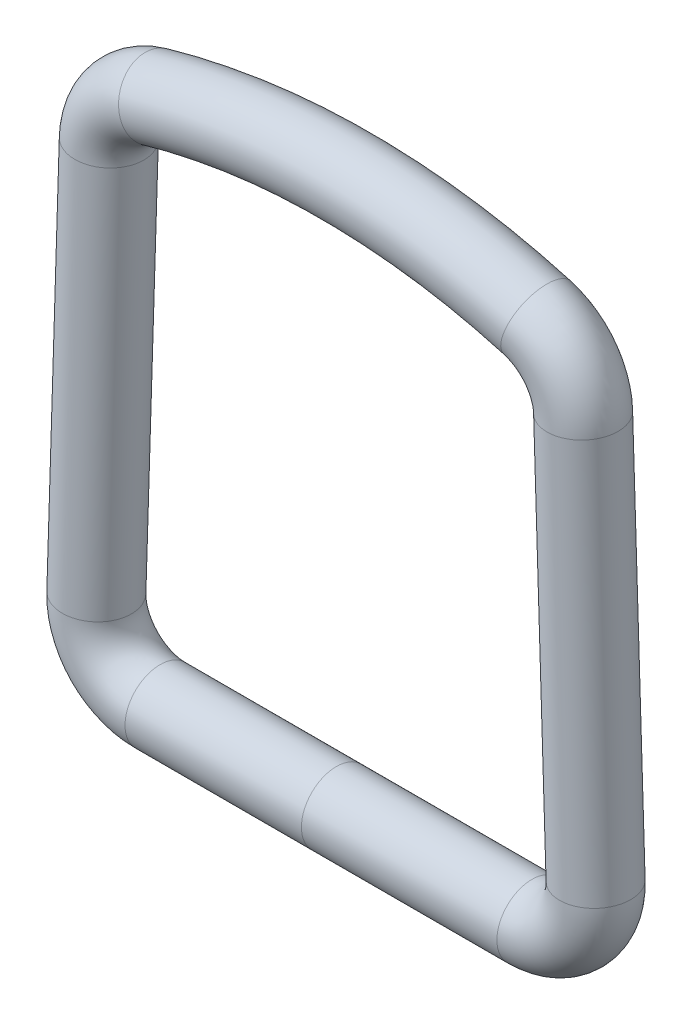
ISO-10303-21;
HEADER;
FILE_DESCRIPTION(('STEP AP214'),'2;1');
FILE_NAME('part.step','',(''),(''),'','','');
FILE_SCHEMA(('AUTOMOTIVE_DESIGN { 1 0 10303 214 1 1 1 1 }'));
ENDSEC;
DATA;
#1=APPLICATION_CONTEXT('core data for automotive mechanical design processes');
#2=APPLICATION_PROTOCOL_DEFINITION('international standard','automotive_design',2000,#1);
#3=PRODUCT_CONTEXT('',#1,'mechanical');
#4=PRODUCT('Part','Part','',(#3));
#5=PRODUCT_RELATED_PRODUCT_CATEGORY('part','',(#4));
#6=PRODUCT_DEFINITION_FORMATION('','',#4);
#7=PRODUCT_DEFINITION_CONTEXT('part definition',#1,'design');
#8=PRODUCT_DEFINITION('design','',#6,#7);
#9=PRODUCT_DEFINITION_SHAPE('','',#8);
#10=(LENGTH_UNIT() NAMED_UNIT(*) SI_UNIT(.MILLI.,.METRE.));
#11=(NAMED_UNIT(*) PLANE_ANGLE_UNIT() SI_UNIT($,.RADIAN.));
#12=(NAMED_UNIT(*) SI_UNIT($,.STERADIAN.) SOLID_ANGLE_UNIT());
#13=UNCERTAINTY_MEASURE_WITH_UNIT(LENGTH_MEASURE(1.E-05),#10,'distance_accuracy_value','');
#14=(GEOMETRIC_REPRESENTATION_CONTEXT(3) GLOBAL_UNCERTAINTY_ASSIGNED_CONTEXT((#13)) GLOBAL_UNIT_ASSIGNED_CONTEXT((#10,
#11,#12)) REPRESENTATION_CONTEXT('',''));
#15=CARTESIAN_POINT('',(0.,0.,0.));
#16=DIRECTION('',(0.,0.,1.));
#17=DIRECTION('',(1.,0.,0.));
#18=AXIS2_PLACEMENT_3D('',#15,#16,#17);
#19=CARTESIAN_POINT('',(2.06347632419776,0.,0.));
#20=DIRECTION('',(1.,0.,0.));
#21=DIRECTION('',(0.,1.,0.));
#22=AXIS2_PLACEMENT_3D('',#19,#20,#21);
#23=CYLINDRICAL_SURFACE('',#22,1.1);
#24=CARTESIAN_POINT('',(7.6,0.,0.));
#25=DIRECTION('',(1.,0.,0.));
#26=DIRECTION('',(0.,0.,-1.));
#27=AXIS2_PLACEMENT_3D('',#24,#25,#26);
#28=CIRCLE('',#27,1.1);
#29=CARTESIAN_POINT('',(7.6,0.,-1.1));
#30=VERTEX_POINT('',#29);
#31=EDGE_CURVE('E63',#30,#30,#28,.T.);
#32=ORIENTED_EDGE('',*,*,#31,.F.);
#33=EDGE_LOOP('',(#32));
#34=FACE_BOUND('',#33,.T.);
#35=CARTESIAN_POINT('',(2.06347632419776,0.,0.));
#36=DIRECTION('',(1.,0.,0.));
#37=DIRECTION('',(0.,0.,-1.));
#38=AXIS2_PLACEMENT_3D('',#35,#36,#37);
#39=CIRCLE('',#38,1.1);
#40=CARTESIAN_POINT('',(2.06347632419776,-1.1,0.));
#41=VERTEX_POINT('',#40);
#42=EDGE_CURVE('E10',#41,#41,#39,.T.);
#43=ORIENTED_EDGE('',*,*,#42,.T.);
#44=EDGE_LOOP('',(#43));
#45=FACE_BOUND('',#44,.T.);
#46=ADVANCED_FACE('F32',(#34,#45),#23,.T.);
#47=CARTESIAN_POINT('',(2.06347632419777,2.,0.));
#48=DIRECTION('',(0.,0.,1.));
#49=DIRECTION('',(1.,0.,0.));
#50=AXIS2_PLACEMENT_3D('',#47,#48,#49);
#51=TOROIDAL_SURFACE('',#50,2.,1.1);
#52=CARTESIAN_POINT('',(0.064452172023606,2.06246950475544,0.));
#53=DIRECTION('',(-0.0312347523777213,-0.999512076087079,0.));
#54=DIRECTION('',(0.,0.,-1.));
#55=AXIS2_PLACEMENT_3D('',#52,#53,#54);
#56=CIRCLE('',#55,1.1);
#57=CARTESIAN_POINT('',(-1.03501111167218,2.09682773237093,0.));
#58=VERTEX_POINT('',#57);
#59=EDGE_CURVE('E38',#58,#58,#56,.T.);
#60=CARTESIAN_POINT('',(2.06347632419777,2.,0.));
#61=DIRECTION('',(0.,0.,1.));
#62=DIRECTION('',(1.,0.,0.));
#63=AXIS2_PLACEMENT_3D('',#60,#61,#62);
#64=CIRCLE('',#63,3.1);
#65=EDGE_CURVE('',#58,#41,#64,.T.);
#66=ORIENTED_EDGE('',*,*,#59,.T.);
#67=ORIENTED_EDGE('',*,*,#42,.F.);
#68=ORIENTED_EDGE('',*,*,#65,.T.);
#69=ORIENTED_EDGE('',*,*,#65,.F.);
#70=EDGE_LOOP('',(#66,#68,#67,#69));
#71=FACE_BOUND('',#70,.T.);
#72=ADVANCED_FACE('F70',(#71),#51,.T.);
#73=CARTESIAN_POINT('',(0.456110610602567,14.5955395392822,0.));
#74=DIRECTION('',(-0.0312347523777212,-0.999512076087079,0.));
#75=DIRECTION('',(0.999512076087079,-0.0312347523777212,0.));
#76=AXIS2_PLACEMENT_3D('',#73,#74,#75);
#77=CYLINDRICAL_SURFACE('',#76,1.1);
#78=ORIENTED_EDGE('',*,*,#59,.F.);
#79=EDGE_LOOP('',(#78));
#80=FACE_BOUND('',#79,.T.);
#81=CARTESIAN_POINT('',(0.45611061060257,14.5955395392822,0.));
#82=DIRECTION('',(-0.0312347523777208,-0.999512076087079,0.));
#83=DIRECTION('',(0.,0.,-1.));
#84=AXIS2_PLACEMENT_3D('',#81,#82,#83);
#85=CIRCLE('',#84,1.1);
#86=CARTESIAN_POINT('',(-0.643352673093218,14.6298977668977,0.));
#87=VERTEX_POINT('',#86);
#88=EDGE_CURVE('E42',#87,#87,#85,.T.);
#89=ORIENTED_EDGE('',*,*,#88,.T.);
#90=EDGE_LOOP('',(#89));
#91=FACE_BOUND('',#90,.T.);
#92=ADVANCED_FACE('F74',(#80,#91),#77,.T.);
#93=CARTESIAN_POINT('',(2.45513476277672,14.5330700345268,0.));
#94=DIRECTION('',(0.,0.,1.));
#95=DIRECTION('',(1.,0.,0.));
#96=AXIS2_PLACEMENT_3D('',#93,#94,#95);
#97=TOROIDAL_SURFACE('',#96,2.,1.1);
#98=CARTESIAN_POINT('',(1.90268014358529,16.4552547014446,0.));
#99=DIRECTION('',(-0.96109233345892,-0.276227309595717,0.));
#100=DIRECTION('',(0.,0.,-1.));
#101=AXIS2_PLACEMENT_3D('',#98,#99,#100);
#102=CIRCLE('',#101,1.1);
#103=CARTESIAN_POINT('',(1.59883010303,17.5124562682494,0.));
#104=VERTEX_POINT('',#103);
#105=EDGE_CURVE('E46',#104,#104,#102,.T.);
#106=CARTESIAN_POINT('',(2.45513476277672,14.5330700345268,0.));
#107=DIRECTION('',(0.,0.,1.));
#108=DIRECTION('',(1.,0.,0.));
#109=AXIS2_PLACEMENT_3D('',#106,#107,#108);
#110=CIRCLE('',#109,3.1);
#111=EDGE_CURVE('',#104,#87,#110,.T.);
#112=ORIENTED_EDGE('',*,*,#105,.T.);
#113=ORIENTED_EDGE('',*,*,#88,.F.);
#114=ORIENTED_EDGE('',*,*,#111,.T.);
#115=ORIENTED_EDGE('',*,*,#111,.F.);
#116=EDGE_LOOP('',(#112,#114,#113,#115));
#117=FACE_BOUND('',#116,.T.);
#118=ADVANCED_FACE('F79',(#117),#97,.T.);
#119=CARTESIAN_POINT('',(7.9,-4.41153846153848,0.));
#120=DIRECTION('',(0.,0.,1.));
#121=DIRECTION('',(1.,0.,0.));
#122=AXIS2_PLACEMENT_3D('',#119,#120,#121);
#123=TOROIDAL_SURFACE('',#122,21.7115384615385,1.1);
#124=CARTESIAN_POINT('',(13.8973198564147,16.4552547014446,0.));
#125=DIRECTION('',(-0.96109233345892,0.276227309595717,0.));
#126=DIRECTION('',(0.,0.,-1.));
#127=AXIS2_PLACEMENT_3D('',#124,#125,#126);
#128=CIRCLE('',#127,1.1);
#129=CARTESIAN_POINT('',(14.20116989697,17.5124562682494,0.));
#130=VERTEX_POINT('',#129);
#131=EDGE_CURVE('E51',#130,#130,#128,.T.);
#132=CARTESIAN_POINT('',(7.9,-4.41153846153848,0.));
#133=DIRECTION('',(0.,0.,1.));
#134=DIRECTION('',(1.,0.,0.));
#135=AXIS2_PLACEMENT_3D('',#132,#133,#134);
#136=CIRCLE('',#135,22.8115384615385);
#137=EDGE_CURVE('',#130,#104,#136,.T.);
#138=ORIENTED_EDGE('',*,*,#131,.T.);
#139=ORIENTED_EDGE('',*,*,#105,.F.);
#140=ORIENTED_EDGE('',*,*,#137,.T.);
#141=ORIENTED_EDGE('',*,*,#137,.F.);
#142=EDGE_LOOP('',(#138,#140,#139,#141));
#143=FACE_BOUND('',#142,.T.);
#144=ADVANCED_FACE('F85',(#143),#123,.T.);
#145=CARTESIAN_POINT('',(13.3448652372233,14.5330700345268,0.));
#146=DIRECTION('',(0.,0.,1.));
#147=DIRECTION('',(1.,0.,0.));
#148=AXIS2_PLACEMENT_3D('',#145,#146,#147);
#149=TOROIDAL_SURFACE('',#148,2.,1.1);
#150=CARTESIAN_POINT('',(15.3438893893974,14.5955395392822,0.));
#151=DIRECTION('',(-0.0312347523777213,0.999512076087079,0.));
#152=DIRECTION('',(0.,0.,-1.));
#153=AXIS2_PLACEMENT_3D('',#150,#151,#152);
#154=CIRCLE('',#153,1.1);
#155=CARTESIAN_POINT('',(16.4433526730932,14.6298977668977,0.));
#156=VERTEX_POINT('',#155);
#157=EDGE_CURVE('E54',#156,#156,#154,.T.);
#158=CARTESIAN_POINT('',(13.3448652372233,14.5330700345268,0.));
#159=DIRECTION('',(0.,0.,1.));
#160=DIRECTION('',(1.,0.,0.));
#161=AXIS2_PLACEMENT_3D('',#158,#159,#160);
#162=CIRCLE('',#161,3.1);
#163=EDGE_CURVE('',#156,#130,#162,.T.);
#164=ORIENTED_EDGE('',*,*,#157,.T.);
#165=ORIENTED_EDGE('',*,*,#131,.F.);
#166=ORIENTED_EDGE('',*,*,#163,.T.);
#167=ORIENTED_EDGE('',*,*,#163,.F.);
#168=EDGE_LOOP('',(#164,#166,#165,#167));
#169=FACE_BOUND('',#168,.T.);
#170=ADVANCED_FACE('F89',(#169),#149,.T.);
#171=CARTESIAN_POINT('',(15.7355478279764,2.06246950475544,0.));
#172=DIRECTION('',(-0.0312347523777214,0.999512076087079,0.));
#173=DIRECTION('',(-0.999512076087079,-0.0312347523777214,0.));
#174=AXIS2_PLACEMENT_3D('',#171,#172,#173);
#175=CYLINDRICAL_SURFACE('',#174,1.1);
#176=ORIENTED_EDGE('',*,*,#157,.F.);
#177=EDGE_LOOP('',(#176));
#178=FACE_BOUND('',#177,.T.);
#179=CARTESIAN_POINT('',(15.7355478279764,2.06246950475544,0.));
#180=DIRECTION('',(-0.031234752377721,0.999512076087079,0.));
#181=DIRECTION('',(0.,0.,-1.));
#182=AXIS2_PLACEMENT_3D('',#179,#180,#181);
#183=CIRCLE('',#182,1.1);
#184=CARTESIAN_POINT('',(16.8350111116722,2.09682773237093,0.));
#185=VERTEX_POINT('',#184);
#186=EDGE_CURVE('E57',#185,#185,#183,.T.);
#187=ORIENTED_EDGE('',*,*,#186,.T.);
#188=EDGE_LOOP('',(#187));
#189=FACE_BOUND('',#188,.T.);
#190=ADVANCED_FACE('F93',(#178,#189),#175,.T.);
#191=CARTESIAN_POINT('',(13.7365236758022,2.,0.));
#192=DIRECTION('',(0.,0.,1.));
#193=DIRECTION('',(1.,0.,0.));
#194=AXIS2_PLACEMENT_3D('',#191,#192,#193);
#195=TOROIDAL_SURFACE('',#194,2.,1.1);
#196=CARTESIAN_POINT('',(13.7365236758022,0.,0.));
#197=DIRECTION('',(1.,0.,0.));
#198=DIRECTION('',(0.,0.,-1.));
#199=AXIS2_PLACEMENT_3D('',#196,#197,#198);
#200=CIRCLE('',#199,1.1);
#201=CARTESIAN_POINT('',(13.7365236758022,-1.1,0.));
#202=VERTEX_POINT('',#201);
#203=EDGE_CURVE('E60',#202,#202,#200,.T.);
#204=CARTESIAN_POINT('',(13.7365236758022,2.,0.));
#205=DIRECTION('',(0.,0.,1.));
#206=DIRECTION('',(1.,0.,0.));
#207=AXIS2_PLACEMENT_3D('',#204,#205,#206);
#208=CIRCLE('',#207,3.1);
#209=EDGE_CURVE('',#202,#185,#208,.T.);
#210=ORIENTED_EDGE('',*,*,#203,.T.);
#211=ORIENTED_EDGE('',*,*,#186,.F.);
#212=ORIENTED_EDGE('',*,*,#209,.T.);
#213=ORIENTED_EDGE('',*,*,#209,.F.);
#214=EDGE_LOOP('',(#210,#212,#211,#213));
#215=FACE_BOUND('',#214,.T.);
#216=ADVANCED_FACE('F97',(#215),#195,.T.);
#217=CARTESIAN_POINT('',(7.6,0.,0.));
#218=DIRECTION('',(1.,0.,0.));
#219=DIRECTION('',(0.,1.,0.));
#220=AXIS2_PLACEMENT_3D('',#217,#218,#219);
#221=CYLINDRICAL_SURFACE('',#220,1.1);
#222=ORIENTED_EDGE('',*,*,#203,.F.);
#223=EDGE_LOOP('',(#222));
#224=FACE_BOUND('',#223,.T.);
#225=ORIENTED_EDGE('',*,*,#31,.T.);
#226=EDGE_LOOP('',(#225));
#227=FACE_BOUND('',#226,.T.);
#228=ADVANCED_FACE('F67',(#224,#227),#221,.T.);
#229=CLOSED_SHELL('',(#46,#72,#92,#118,#144,#170,#190,#216,#228));
#230=MANIFOLD_SOLID_BREP('B2',#229);
#231=ADVANCED_BREP_SHAPE_REPRESENTATION('',(#18,#230),#14);
#232=SHAPE_DEFINITION_REPRESENTATION(#9,#231);
ENDSEC;
END-ISO-10303-21;
